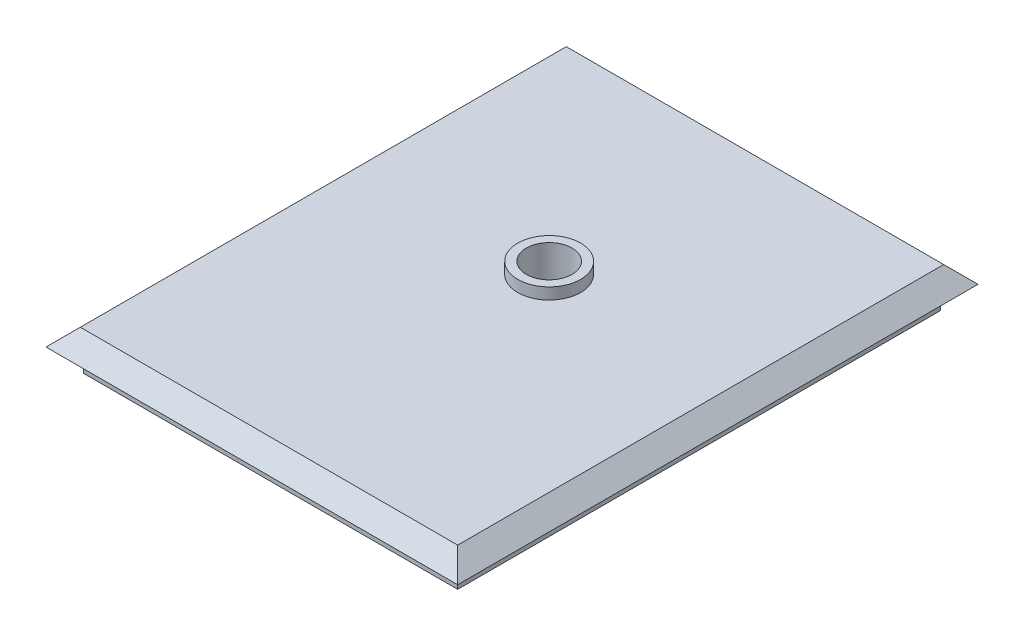
ISO-10303-21;
HEADER;
FILE_DESCRIPTION(('STEP AP214'),'2;1');
FILE_NAME('part.step','',(''),(''),'','','');
FILE_SCHEMA(('AUTOMOTIVE_DESIGN { 1 0 10303 214 1 1 1 1 }'));
ENDSEC;
DATA;
#1=APPLICATION_CONTEXT('core data for automotive mechanical design processes');
#2=APPLICATION_PROTOCOL_DEFINITION('international standard','automotive_design',2000,#1);
#3=PRODUCT_CONTEXT('',#1,'mechanical');
#4=PRODUCT('Part','Part','',(#3));
#5=PRODUCT_RELATED_PRODUCT_CATEGORY('part','',(#4));
#6=PRODUCT_DEFINITION_FORMATION('','',#4);
#7=PRODUCT_DEFINITION_CONTEXT('part definition',#1,'design');
#8=PRODUCT_DEFINITION('design','',#6,#7);
#9=PRODUCT_DEFINITION_SHAPE('','',#8);
#10=(LENGTH_UNIT() NAMED_UNIT(*) SI_UNIT(.MILLI.,.METRE.));
#11=(NAMED_UNIT(*) PLANE_ANGLE_UNIT() SI_UNIT($,.RADIAN.));
#12=(NAMED_UNIT(*) SI_UNIT($,.STERADIAN.) SOLID_ANGLE_UNIT());
#13=UNCERTAINTY_MEASURE_WITH_UNIT(LENGTH_MEASURE(1.E-05),#10,'distance_accuracy_value','');
#14=(GEOMETRIC_REPRESENTATION_CONTEXT(3) GLOBAL_UNCERTAINTY_ASSIGNED_CONTEXT((#13)) GLOBAL_UNIT_ASSIGNED_CONTEXT((#10,
#11,#12)) REPRESENTATION_CONTEXT('',''));
#15=CARTESIAN_POINT('',(0.,0.,0.));
#16=DIRECTION('',(0.,0.,1.));
#17=DIRECTION('',(1.,0.,0.));
#18=AXIS2_PLACEMENT_3D('',#15,#16,#17);
#19=CARTESIAN_POINT('',(0.,-10.,0.));
#20=DIRECTION('',(0.,-1.,0.));
#21=DIRECTION('',(0.,0.,-1.));
#22=AXIS2_PLACEMENT_3D('',#19,#20,#21);
#23=PLANE('',#22);
#24=CARTESIAN_POINT('',(64.5,-10.,-3.));
#25=DIRECTION('',(0.,-1.,0.));
#26=DIRECTION('',(0.,0.,-1.));
#27=AXIS2_PLACEMENT_3D('',#24,#25,#26);
#28=CIRCLE('',#27,2.);
#29=CARTESIAN_POINT('',(64.5,-10.,-5.));
#30=VERTEX_POINT('',#29);
#31=EDGE_CURVE('E150',#30,#30,#28,.T.);
#32=ORIENTED_EDGE('',*,*,#31,.F.);
#33=EDGE_LOOP('',(#32));
#34=FACE_BOUND('',#33,.T.);
#35=DIRECTION('',(0.,0.,-1.));
#36=VECTOR('',#35,1.);
#37=CARTESIAN_POINT('',(48.15,-10.,-20.85));
#38=LINE('',#37,#36);
#39=CARTESIAN_POINT('',(48.15,-10.,21.35));
#40=VERTEX_POINT('',#39);
#41=CARTESIAN_POINT('',(48.15,-10.,-20.85));
#42=VERTEX_POINT('',#41);
#43=EDGE_CURVE('E238',#40,#42,#38,.T.);
#44=ORIENTED_EDGE('',*,*,#43,.T.);
#45=DIRECTION('',(1.,0.,0.));
#46=VECTOR('',#45,1.);
#47=CARTESIAN_POINT('',(48.15,-10.,-20.85));
#48=LINE('',#47,#46);
#49=CARTESIAN_POINT('',(80.85,-10.,-20.85));
#50=VERTEX_POINT('',#49);
#51=EDGE_CURVE('E245',#42,#50,#48,.T.);
#52=ORIENTED_EDGE('',*,*,#51,.T.);
#53=DIRECTION('',(0.,0.,1.));
#54=VECTOR('',#53,1.);
#55=CARTESIAN_POINT('',(80.85,-10.,-20.85));
#56=LINE('',#55,#54);
#57=CARTESIAN_POINT('',(80.85,-10.,21.35));
#58=VERTEX_POINT('',#57);
#59=EDGE_CURVE('E219',#50,#58,#56,.T.);
#60=ORIENTED_EDGE('',*,*,#59,.T.);
#61=DIRECTION('',(-1.,0.,0.));
#62=VECTOR('',#61,1.);
#63=CARTESIAN_POINT('',(48.15,-10.,21.35));
#64=LINE('',#63,#62);
#65=EDGE_CURVE('E163',#58,#40,#64,.T.);
#66=ORIENTED_EDGE('',*,*,#65,.T.);
#67=EDGE_LOOP('',(#44,#52,#60,#66));
#68=FACE_BOUND('',#67,.T.);
#69=ADVANCED_FACE('F147',(#34,#68),#23,.T.);
#70=CARTESIAN_POINT('',(0.,-6.5,0.));
#71=DIRECTION('',(0.,-1.,0.));
#72=DIRECTION('',(0.,0.,-1.));
#73=AXIS2_PLACEMENT_3D('',#70,#71,#72);
#74=PLANE('',#73);
#75=CARTESIAN_POINT('',(64.5,-6.5,-3.));
#76=DIRECTION('',(0.,1.,0.));
#77=DIRECTION('',(0.,0.,1.));
#78=AXIS2_PLACEMENT_3D('',#75,#76,#77);
#79=CIRCLE('',#78,2.75000000000001);
#80=CARTESIAN_POINT('',(64.5,-6.5,-0.249999999999992));
#81=VERTEX_POINT('',#80);
#82=EDGE_CURVE('E13',#81,#81,#79,.T.);
#83=ORIENTED_EDGE('',*,*,#82,.F.);
#84=EDGE_LOOP('',(#83));
#85=FACE_BOUND('',#84,.T.);
#86=DIRECTION('',(0.,0.,-1.));
#87=VECTOR('',#86,1.);
#88=CARTESIAN_POINT('',(81.,-6.5,-21.));
#89=LINE('',#88,#87);
#90=CARTESIAN_POINT('',(81.,-6.5,21.5));
#91=VERTEX_POINT('',#90);
#92=CARTESIAN_POINT('',(81.,-6.5,-21.));
#93=VERTEX_POINT('',#92);
#94=EDGE_CURVE('E258',#91,#93,#89,.T.);
#95=ORIENTED_EDGE('',*,*,#94,.T.);
#96=DIRECTION('',(-1.,0.,0.));
#97=VECTOR('',#96,1.);
#98=CARTESIAN_POINT('',(81.,-6.5,-21.));
#99=LINE('',#98,#97);
#100=CARTESIAN_POINT('',(48.,-6.5,-21.));
#101=VERTEX_POINT('',#100);
#102=EDGE_CURVE('E293',#93,#101,#99,.T.);
#103=ORIENTED_EDGE('',*,*,#102,.T.);
#104=DIRECTION('',(0.,0.,1.));
#105=VECTOR('',#104,1.);
#106=CARTESIAN_POINT('',(48.,-6.5,-21.));
#107=LINE('',#106,#105);
#108=CARTESIAN_POINT('',(48.,-6.5,21.5));
#109=VERTEX_POINT('',#108);
#110=EDGE_CURVE('E307',#101,#109,#107,.T.);
#111=ORIENTED_EDGE('',*,*,#110,.T.);
#112=DIRECTION('',(1.,0.,0.));
#113=VECTOR('',#112,1.);
#114=CARTESIAN_POINT('',(81.,-6.5,21.5));
#115=LINE('',#114,#113);
#116=EDGE_CURVE('E348',#109,#91,#115,.T.);
#117=ORIENTED_EDGE('',*,*,#116,.T.);
#118=EDGE_LOOP('',(#95,#103,#111,#117));
#119=FACE_BOUND('',#118,.T.);
#120=ADVANCED_FACE('F320',(#85,#119),#74,.F.);
#121=CARTESIAN_POINT('',(81.,-6.5,-21.));
#122=DIRECTION('',(0.707106781186547,0.707106781186548,0.));
#123=DIRECTION('',(0.,0.,1.));
#124=AXIS2_PLACEMENT_3D('',#121,#122,#123);
#125=PLANE('',#124);
#126=ORIENTED_EDGE('',*,*,#94,.F.);
#127=CARTESIAN_POINT('',(81.,-6.5,21.5));
#128=CARTESIAN_POINT('',(81.5,-7.,22.));
#129=CARTESIAN_POINT('',(82.,-7.5,22.5));
#130=CARTESIAN_POINT('',(82.5,-8.,23.));
#131=B_SPLINE_CURVE_WITH_KNOTS('',3,(#127,#128,#129,#130),.UNSPECIFIED.,.F.,.F.,(4,4),(0.,1.),.UNSPECIFIED.);
#132=CARTESIAN_POINT('',(82.5,-8.,23.));
#133=VERTEX_POINT('',#132);
#134=EDGE_CURVE('E274',#91,#133,#131,.T.);
#135=ORIENTED_EDGE('',*,*,#134,.T.);
#136=DIRECTION('',(0.,0.,1.));
#137=VECTOR('',#136,1.);
#138=CARTESIAN_POINT('',(82.5,-8.,23.));
#139=LINE('',#138,#137);
#140=CARTESIAN_POINT('',(82.5,-8.,-22.5));
#141=VERTEX_POINT('',#140);
#142=EDGE_CURVE('E419',#141,#133,#139,.T.);
#143=ORIENTED_EDGE('',*,*,#142,.F.);
#144=CARTESIAN_POINT('',(81.,-6.5,-21.));
#145=CARTESIAN_POINT('',(81.5,-7.,-21.5));
#146=CARTESIAN_POINT('',(82.,-7.5,-22.));
#147=CARTESIAN_POINT('',(82.5,-8.,-22.5));
#148=B_SPLINE_CURVE_WITH_KNOTS('',3,(#144,#145,#146,#147),.UNSPECIFIED.,.F.,.F.,(4,4),(0.,1.),.UNSPECIFIED.);
#149=EDGE_CURVE('E263',#93,#141,#148,.T.);
#150=ORIENTED_EDGE('',*,*,#149,.F.);
#151=EDGE_LOOP('',(#126,#135,#143,#150));
#152=FACE_BOUND('',#151,.T.);
#153=ADVANCED_FACE('F330',(#152),#125,.T.);
#154=CARTESIAN_POINT('',(48.,-6.5,-21.));
#155=DIRECTION('',(0.,0.707106781186549,-0.707106781186546));
#156=DIRECTION('',(1.,0.,0.));
#157=AXIS2_PLACEMENT_3D('',#154,#155,#156);
#158=PLANE('',#157);
#159=ORIENTED_EDGE('',*,*,#102,.F.);
#160=ORIENTED_EDGE('',*,*,#149,.T.);
#161=DIRECTION('',(1.,0.,0.));
#162=VECTOR('',#161,1.);
#163=CARTESIAN_POINT('',(-46.,-8.,-22.5));
#164=LINE('',#163,#162);
#165=CARTESIAN_POINT('',(46.5,-8.,-22.5));
#166=VERTEX_POINT('',#165);
#167=EDGE_CURVE('E284',#166,#141,#164,.T.);
#168=ORIENTED_EDGE('',*,*,#167,.F.);
#169=CARTESIAN_POINT('',(48.,-6.5,-21.));
#170=CARTESIAN_POINT('',(47.5,-7.,-21.5));
#171=CARTESIAN_POINT('',(47.,-7.5,-22.));
#172=CARTESIAN_POINT('',(46.5,-8.,-22.5));
#173=B_SPLINE_CURVE_WITH_KNOTS('',3,(#169,#170,#171,#172),.UNSPECIFIED.,.F.,.F.,(4,4),(0.,1.),.UNSPECIFIED.);
#174=EDGE_CURVE('E260',#101,#166,#173,.T.);
#175=ORIENTED_EDGE('',*,*,#174,.F.);
#176=EDGE_LOOP('',(#159,#160,#168,#175));
#177=FACE_BOUND('',#176,.T.);
#178=ADVANCED_FACE('F384',(#177),#158,.T.);
#179=CARTESIAN_POINT('',(48.,-6.5,21.5));
#180=DIRECTION('',(-0.707106781186547,0.707106781186548,0.));
#181=DIRECTION('',(0.,0.,-1.));
#182=AXIS2_PLACEMENT_3D('',#179,#180,#181);
#183=PLANE('',#182);
#184=ORIENTED_EDGE('',*,*,#110,.F.);
#185=ORIENTED_EDGE('',*,*,#174,.T.);
#186=DIRECTION('',(0.,0.,1.));
#187=VECTOR('',#186,1.);
#188=CARTESIAN_POINT('',(46.5,-8.,23.));
#189=LINE('',#188,#187);
#190=CARTESIAN_POINT('',(46.5,-8.,23.));
#191=VERTEX_POINT('',#190);
#192=EDGE_CURVE('E155',#166,#191,#189,.T.);
#193=ORIENTED_EDGE('',*,*,#192,.T.);
#194=CARTESIAN_POINT('',(48.,-6.5,21.5));
#195=CARTESIAN_POINT('',(47.5,-7.,22.));
#196=CARTESIAN_POINT('',(47.,-7.5,22.5));
#197=CARTESIAN_POINT('',(46.5,-8.,23.));
#198=B_SPLINE_CURVE_WITH_KNOTS('',3,(#194,#195,#196,#197),.UNSPECIFIED.,.F.,.F.,(4,4),(0.,1.),.UNSPECIFIED.);
#199=EDGE_CURVE('E264',#109,#191,#198,.T.);
#200=ORIENTED_EDGE('',*,*,#199,.F.);
#201=EDGE_LOOP('',(#184,#185,#193,#200));
#202=FACE_BOUND('',#201,.T.);
#203=ADVANCED_FACE('F393',(#202),#183,.T.);
#204=CARTESIAN_POINT('',(81.,-6.5,21.5));
#205=DIRECTION('',(0.,0.707106781186548,0.707106781186547));
#206=DIRECTION('',(-1.,0.,0.));
#207=AXIS2_PLACEMENT_3D('',#204,#205,#206);
#208=PLANE('',#207);
#209=ORIENTED_EDGE('',*,*,#116,.F.);
#210=ORIENTED_EDGE('',*,*,#199,.T.);
#211=DIRECTION('',(-1.,0.,0.));
#212=VECTOR('',#211,1.);
#213=CARTESIAN_POINT('',(-46.,-8.,23.));
#214=LINE('',#213,#212);
#215=EDGE_CURVE('E171',#133,#191,#214,.T.);
#216=ORIENTED_EDGE('',*,*,#215,.F.);
#217=ORIENTED_EDGE('',*,*,#134,.F.);
#218=EDGE_LOOP('',(#209,#210,#216,#217));
#219=FACE_BOUND('',#218,.T.);
#220=ADVANCED_FACE('F396',(#219),#208,.T.);
#221=CARTESIAN_POINT('',(64.5,-5.5,-3.));
#222=DIRECTION('',(0.,1.,0.));
#223=DIRECTION('',(0.,0.,1.));
#224=AXIS2_PLACEMENT_3D('',#221,#222,#223);
#225=PLANE('',#224);
#226=CARTESIAN_POINT('',(64.5,-5.5,-3.));
#227=DIRECTION('',(0.,1.,0.));
#228=DIRECTION('',(0.,0.,1.));
#229=AXIS2_PLACEMENT_3D('',#226,#227,#228);
#230=CIRCLE('',#229,2.75000000000001);
#231=CARTESIAN_POINT('',(64.5,-5.5,-0.249999999999992));
#232=VERTEX_POINT('',#231);
#233=EDGE_CURVE('E256',#232,#232,#230,.T.);
#234=ORIENTED_EDGE('',*,*,#233,.T.);
#235=EDGE_LOOP('',(#234));
#236=FACE_BOUND('',#235,.T.);
#237=CARTESIAN_POINT('',(64.5,-5.5,-3.));
#238=DIRECTION('',(0.,1.,0.));
#239=DIRECTION('',(0.,0.,1.));
#240=AXIS2_PLACEMENT_3D('',#237,#238,#239);
#241=CIRCLE('',#240,2.);
#242=CARTESIAN_POINT('',(64.5,-5.5,-1.));
#243=VERTEX_POINT('',#242);
#244=EDGE_CURVE('E253',#243,#243,#241,.T.);
#245=ORIENTED_EDGE('',*,*,#244,.F.);
#246=EDGE_LOOP('',(#245));
#247=FACE_BOUND('',#246,.T.);
#248=ADVANCED_FACE('F433',(#236,#247),#225,.T.);
#249=CARTESIAN_POINT('',(64.5,-5.5,-3.));
#250=DIRECTION('',(0.,-1.,0.));
#251=DIRECTION('',(0.,0.,-1.));
#252=AXIS2_PLACEMENT_3D('',#249,#250,#251);
#253=CYLINDRICAL_SURFACE('',#252,2.75000000000001);
#254=ORIENTED_EDGE('',*,*,#233,.F.);
#255=EDGE_LOOP('',(#254));
#256=FACE_BOUND('',#255,.T.);
#257=ORIENTED_EDGE('',*,*,#82,.T.);
#258=EDGE_LOOP('',(#257));
#259=FACE_BOUND('',#258,.T.);
#260=ADVANCED_FACE('F332',(#256,#259),#253,.T.);
#261=CARTESIAN_POINT('',(64.5,-5.5,-3.));
#262=DIRECTION('',(0.,-1.,0.));
#263=DIRECTION('',(0.,0.,-1.));
#264=AXIS2_PLACEMENT_3D('',#261,#262,#263);
#265=CYLINDRICAL_SURFACE('',#264,2.);
#266=ORIENTED_EDGE('',*,*,#244,.T.);
#267=EDGE_LOOP('',(#266));
#268=FACE_BOUND('',#267,.T.);
#269=ORIENTED_EDGE('',*,*,#31,.T.);
#270=EDGE_LOOP('',(#269));
#271=FACE_BOUND('',#270,.T.);
#272=ADVANCED_FACE('F462',(#268,#271),#265,.F.);
#273=CARTESIAN_POINT('',(0.,-8.,0.));
#274=DIRECTION('',(0.,1.,0.));
#275=DIRECTION('',(0.,0.,1.));
#276=AXIS2_PLACEMENT_3D('',#273,#274,#275);
#277=PLANE('',#276);
#278=DIRECTION('',(1.,0.,0.));
#279=VECTOR('',#278,1.);
#280=CARTESIAN_POINT('',(48.15,-8.,-20.85));
#281=LINE('',#280,#279);
#282=CARTESIAN_POINT('',(48.15,-8.,-20.85));
#283=VERTEX_POINT('',#282);
#284=CARTESIAN_POINT('',(80.85,-8.,-20.85));
#285=VERTEX_POINT('',#284);
#286=EDGE_CURVE('E231',#283,#285,#281,.T.);
#287=ORIENTED_EDGE('',*,*,#286,.F.);
#288=DIRECTION('',(0.,0.,-1.));
#289=VECTOR('',#288,1.);
#290=CARTESIAN_POINT('',(48.15,-8.,-20.85));
#291=LINE('',#290,#289);
#292=CARTESIAN_POINT('',(48.15,-8.,21.35));
#293=VERTEX_POINT('',#292);
#294=EDGE_CURVE('E225',#293,#283,#291,.T.);
#295=ORIENTED_EDGE('',*,*,#294,.F.);
#296=DIRECTION('',(-1.,0.,0.));
#297=VECTOR('',#296,1.);
#298=CARTESIAN_POINT('',(48.15,-8.,21.35));
#299=LINE('',#298,#297);
#300=CARTESIAN_POINT('',(80.85,-8.,21.35));
#301=VERTEX_POINT('',#300);
#302=EDGE_CURVE('E234',#301,#293,#299,.T.);
#303=ORIENTED_EDGE('',*,*,#302,.F.);
#304=DIRECTION('',(0.,0.,1.));
#305=VECTOR('',#304,1.);
#306=CARTESIAN_POINT('',(80.85,-8.,-20.85));
#307=LINE('',#306,#305);
#308=EDGE_CURVE('E217',#285,#301,#307,.T.);
#309=ORIENTED_EDGE('',*,*,#308,.F.);
#310=EDGE_LOOP('',(#287,#295,#303,#309));
#311=FACE_BOUND('',#310,.T.);
#312=ORIENTED_EDGE('',*,*,#192,.F.);
#313=ORIENTED_EDGE('',*,*,#167,.T.);
#314=ORIENTED_EDGE('',*,*,#142,.T.);
#315=ORIENTED_EDGE('',*,*,#215,.T.);
#316=EDGE_LOOP('',(#312,#313,#314,#315));
#317=FACE_BOUND('',#316,.T.);
#318=ADVANCED_FACE('F229',(#311,#317),#277,.F.);
#319=CARTESIAN_POINT('',(48.15,-8.,-20.85));
#320=DIRECTION('',(0.,0.,-1.));
#321=DIRECTION('',(-1.,0.,0.));
#322=AXIS2_PLACEMENT_3D('',#319,#320,#321);
#323=PLANE('',#322);
#324=ORIENTED_EDGE('',*,*,#51,.F.);
#325=DIRECTION('',(0.,-1.,0.));
#326=VECTOR('',#325,1.);
#327=CARTESIAN_POINT('',(48.15,-8.,-20.85));
#328=LINE('',#327,#326);
#329=EDGE_CURVE('E237',#283,#42,#328,.T.);
#330=ORIENTED_EDGE('',*,*,#329,.F.);
#331=ORIENTED_EDGE('',*,*,#286,.T.);
#332=DIRECTION('',(0.,-1.,0.));
#333=VECTOR('',#332,1.);
#334=CARTESIAN_POINT('',(80.85,-8.,-20.85));
#335=LINE('',#334,#333);
#336=EDGE_CURVE('E214',#285,#50,#335,.T.);
#337=ORIENTED_EDGE('',*,*,#336,.T.);
#338=EDGE_LOOP('',(#324,#330,#331,#337));
#339=FACE_BOUND('',#338,.T.);
#340=ADVANCED_FACE('F236',(#339),#323,.T.);
#341=CARTESIAN_POINT('',(48.15,-8.,-20.85));
#342=DIRECTION('',(-1.,0.,0.));
#343=DIRECTION('',(0.,0.,1.));
#344=AXIS2_PLACEMENT_3D('',#341,#342,#343);
#345=PLANE('',#344);
#346=ORIENTED_EDGE('',*,*,#43,.F.);
#347=DIRECTION('',(0.,-1.,0.));
#348=VECTOR('',#347,1.);
#349=CARTESIAN_POINT('',(48.15,-8.,21.35));
#350=LINE('',#349,#348);
#351=EDGE_CURVE('E250',#293,#40,#350,.T.);
#352=ORIENTED_EDGE('',*,*,#351,.F.);
#353=ORIENTED_EDGE('',*,*,#294,.T.);
#354=ORIENTED_EDGE('',*,*,#329,.T.);
#355=EDGE_LOOP('',(#346,#352,#353,#354));
#356=FACE_BOUND('',#355,.T.);
#357=ADVANCED_FACE('F447',(#356),#345,.T.);
#358=CARTESIAN_POINT('',(48.15,-8.,21.35));
#359=DIRECTION('',(0.,0.,1.));
#360=DIRECTION('',(1.,0.,0.));
#361=AXIS2_PLACEMENT_3D('',#358,#359,#360);
#362=PLANE('',#361);
#363=ORIENTED_EDGE('',*,*,#65,.F.);
#364=DIRECTION('',(0.,-1.,0.));
#365=VECTOR('',#364,1.);
#366=CARTESIAN_POINT('',(80.85,-8.,21.35));
#367=LINE('',#366,#365);
#368=EDGE_CURVE('E224',#301,#58,#367,.T.);
#369=ORIENTED_EDGE('',*,*,#368,.F.);
#370=ORIENTED_EDGE('',*,*,#302,.T.);
#371=ORIENTED_EDGE('',*,*,#351,.T.);
#372=EDGE_LOOP('',(#363,#369,#370,#371));
#373=FACE_BOUND('',#372,.T.);
#374=ADVANCED_FACE('F448',(#373),#362,.T.);
#375=CARTESIAN_POINT('',(80.85,-8.,-20.85));
#376=DIRECTION('',(1.,0.,0.));
#377=DIRECTION('',(0.,0.,-1.));
#378=AXIS2_PLACEMENT_3D('',#375,#376,#377);
#379=PLANE('',#378);
#380=ORIENTED_EDGE('',*,*,#59,.F.);
#381=ORIENTED_EDGE('',*,*,#336,.F.);
#382=ORIENTED_EDGE('',*,*,#308,.T.);
#383=ORIENTED_EDGE('',*,*,#368,.T.);
#384=EDGE_LOOP('',(#380,#381,#382,#383));
#385=FACE_BOUND('',#384,.T.);
#386=ADVANCED_FACE('F216',(#385),#379,.T.);
#387=CLOSED_SHELL('',(#69,#120,#153,#178,#203,#220,#248,#260,#272,#318,#340,#357,#374,#386));
#388=MANIFOLD_SOLID_BREP('B2',#387);
#389=ADVANCED_BREP_SHAPE_REPRESENTATION('',(#18,#388),#14);
#390=SHAPE_DEFINITION_REPRESENTATION(#9,#389);
ENDSEC;
END-ISO-10303-21;
